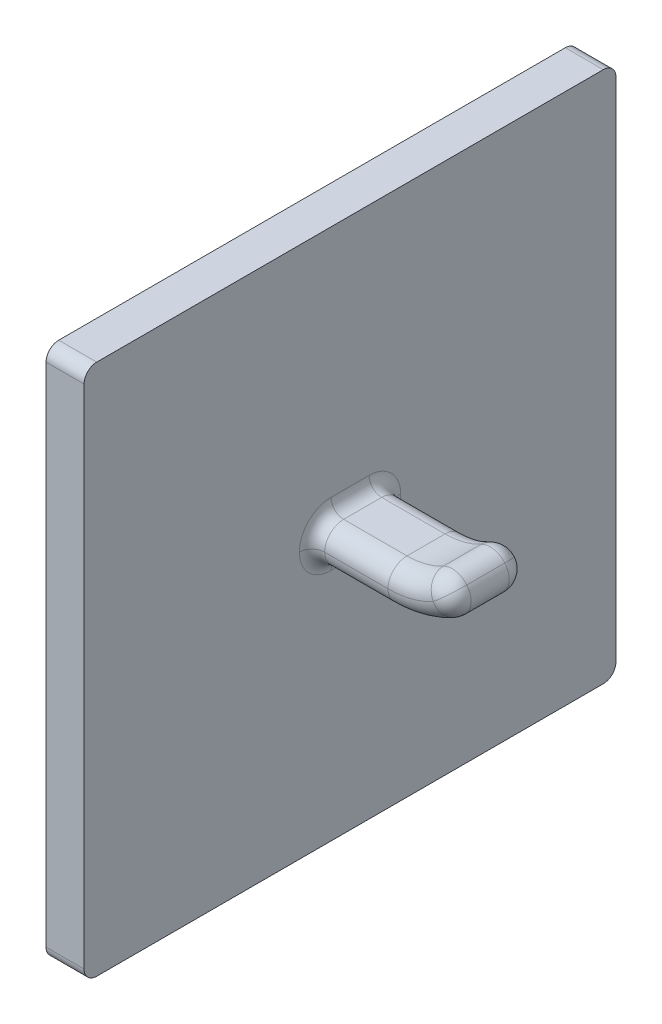
ISO-10303-21;
HEADER;
FILE_DESCRIPTION(('STEP AP214'),'2;1');
FILE_NAME('part.step','',(''),(''),'','','');
FILE_SCHEMA(('AUTOMOTIVE_DESIGN { 1 0 10303 214 1 1 1 1 }'));
ENDSEC;
DATA;
#1=APPLICATION_CONTEXT('core data for automotive mechanical design processes');
#2=APPLICATION_PROTOCOL_DEFINITION('international standard','automotive_design',2000,#1);
#3=PRODUCT_CONTEXT('',#1,'mechanical');
#4=PRODUCT('Part','Part','',(#3));
#5=PRODUCT_RELATED_PRODUCT_CATEGORY('part','',(#4));
#6=PRODUCT_DEFINITION_FORMATION('','',#4);
#7=PRODUCT_DEFINITION_CONTEXT('part definition',#1,'design');
#8=PRODUCT_DEFINITION('design','',#6,#7);
#9=PRODUCT_DEFINITION_SHAPE('','',#8);
#10=(LENGTH_UNIT() NAMED_UNIT(*) SI_UNIT(.MILLI.,.METRE.));
#11=(NAMED_UNIT(*) PLANE_ANGLE_UNIT() SI_UNIT($,.RADIAN.));
#12=(NAMED_UNIT(*) SI_UNIT($,.STERADIAN.) SOLID_ANGLE_UNIT());
#13=UNCERTAINTY_MEASURE_WITH_UNIT(LENGTH_MEASURE(1.E-05),#10,'distance_accuracy_value','');
#14=(GEOMETRIC_REPRESENTATION_CONTEXT(3) GLOBAL_UNCERTAINTY_ASSIGNED_CONTEXT((#13)) GLOBAL_UNIT_ASSIGNED_CONTEXT((#10,
#11,#12)) REPRESENTATION_CONTEXT('',''));
#15=CARTESIAN_POINT('',(0.,0.,0.));
#16=DIRECTION('',(0.,0.,1.));
#17=DIRECTION('',(1.,0.,0.));
#18=AXIS2_PLACEMENT_3D('',#15,#16,#17);
#19=CARTESIAN_POINT('',(0.,-3.,6.));
#20=DIRECTION('',(0.,1.,0.));
#21=DIRECTION('',(0.,0.,1.));
#22=AXIS2_PLACEMENT_3D('',#19,#20,#21);
#23=PLANE('',#22);
#24=DIRECTION('',(1.,0.,0.));
#25=VECTOR('',#24,1.);
#26=CARTESIAN_POINT('',(0.,-3.,4.5));
#27=LINE('',#26,#25);
#28=CARTESIAN_POINT('',(6.,-3.,4.5));
#29=VERTEX_POINT('',#28);
#30=CARTESIAN_POINT('',(1.,-3.,4.5));
#31=VERTEX_POINT('',#30);
#32=EDGE_CURVE('E305',#29,#31,#27,.F.);
#33=ORIENTED_EDGE('',*,*,#32,.T.);
#34=DIRECTION('',(0.,0.,-1.));
#35=VECTOR('',#34,1.);
#36=CARTESIAN_POINT('',(1.,-3.,1.5));
#37=LINE('',#36,#35);
#38=CARTESIAN_POINT('',(1.,-3.,1.5));
#39=VERTEX_POINT('',#38);
#40=EDGE_CURVE('E407',#31,#39,#37,.T.);
#41=ORIENTED_EDGE('',*,*,#40,.T.);
#42=DIRECTION('',(1.,0.,0.));
#43=VECTOR('',#42,1.);
#44=CARTESIAN_POINT('',(0.,-3.,1.5));
#45=LINE('',#44,#43);
#46=CARTESIAN_POINT('',(6.,-3.,1.5));
#47=VERTEX_POINT('',#46);
#48=EDGE_CURVE('E302',#39,#47,#45,.T.);
#49=ORIENTED_EDGE('',*,*,#48,.T.);
#50=DIRECTION('',(0.,0.,-1.));
#51=VECTOR('',#50,1.);
#52=CARTESIAN_POINT('',(6.,-3.,6.));
#53=LINE('',#52,#51);
#54=EDGE_CURVE('E232',#29,#47,#53,.T.);
#55=ORIENTED_EDGE('',*,*,#54,.F.);
#56=EDGE_LOOP('',(#33,#41,#49,#55));
#57=FACE_BOUND('',#56,.T.);
#58=ADVANCED_FACE('F40',(#57),#23,.F.);
#59=CARTESIAN_POINT('',(6.,6.,6.));
#60=DIRECTION('',(0.,0.,-1.));
#61=DIRECTION('',(-1.,0.,0.));
#62=AXIS2_PLACEMENT_3D('',#59,#60,#61);
#63=CYLINDRICAL_SURFACE('',#62,9.);
#64=ORIENTED_EDGE('',*,*,#54,.T.);
#65=CARTESIAN_POINT('',(6.,6.,1.5));
#66=DIRECTION('',(0.,0.,1.));
#67=DIRECTION('',(1.,0.,0.));
#68=AXIS2_PLACEMENT_3D('',#65,#66,#67);
#69=CIRCLE('',#68,9.);
#70=CARTESIAN_POINT('',(10.2893259665609,-1.91212251880532,1.5));
#71=VERTEX_POINT('',#70);
#72=EDGE_CURVE('E293',#47,#71,#69,.T.);
#73=ORIENTED_EDGE('',*,*,#72,.T.);
#74=DIRECTION('',(0.,0.,-1.));
#75=VECTOR('',#74,1.);
#76=CARTESIAN_POINT('',(10.2893259665609,-1.91212251880532,6.));
#77=LINE('',#76,#75);
#78=CARTESIAN_POINT('',(10.2893259665609,-1.91212251880532,4.5));
#79=VERTEX_POINT('',#78);
#80=EDGE_CURVE('E290',#71,#79,#77,.F.);
#81=ORIENTED_EDGE('',*,*,#80,.T.);
#82=CARTESIAN_POINT('',(6.,6.,4.5));
#83=DIRECTION('',(0.,0.,1.));
#84=DIRECTION('',(1.,0.,0.));
#85=AXIS2_PLACEMENT_3D('',#82,#83,#84);
#86=CIRCLE('',#85,9.);
#87=EDGE_CURVE('E287',#79,#29,#86,.F.);
#88=ORIENTED_EDGE('',*,*,#87,.T.);
#89=EDGE_LOOP('',(#64,#73,#81,#88));
#90=FACE_BOUND('',#89,.T.);
#91=ADVANCED_FACE('F476',(#90),#63,.T.);
#92=CARTESIAN_POINT('',(6.,6.,6.));
#93=DIRECTION('',(0.,0.,-1.));
#94=DIRECTION('',(-1.,0.,0.));
#95=AXIS2_PLACEMENT_3D('',#92,#93,#94);
#96=CYLINDRICAL_SURFACE('',#95,6.);
#97=DIRECTION('',(0.,0.,-1.));
#98=VECTOR('',#97,1.);
#99=CARTESIAN_POINT('',(8.85955064437394,0.725251654129786,6.));
#100=LINE('',#99,#98);
#101=CARTESIAN_POINT('',(8.85955064437394,0.725251654129786,4.5));
#102=VERTEX_POINT('',#101);
#103=CARTESIAN_POINT('',(8.85955064437394,0.725251654129786,1.5));
#104=VERTEX_POINT('',#103);
#105=EDGE_CURVE('E280',#102,#104,#100,.T.);
#106=ORIENTED_EDGE('',*,*,#105,.T.);
#107=CARTESIAN_POINT('',(6.,6.,1.5));
#108=DIRECTION('',(0.,0.,1.));
#109=DIRECTION('',(1.,0.,0.));
#110=AXIS2_PLACEMENT_3D('',#107,#108,#109);
#111=CIRCLE('',#110,6.);
#112=CARTESIAN_POINT('',(6.,0.,1.5));
#113=VERTEX_POINT('',#112);
#114=EDGE_CURVE('E283',#104,#113,#111,.F.);
#115=ORIENTED_EDGE('',*,*,#114,.T.);
#116=DIRECTION('',(0.,0.,-1.));
#117=VECTOR('',#116,1.);
#118=CARTESIAN_POINT('',(6.,0.,6.));
#119=LINE('',#118,#117);
#120=CARTESIAN_POINT('',(6.,0.,4.5));
#121=VERTEX_POINT('',#120);
#122=EDGE_CURVE('E228',#121,#113,#119,.T.);
#123=ORIENTED_EDGE('',*,*,#122,.F.);
#124=CARTESIAN_POINT('',(6.,6.,4.5));
#125=DIRECTION('',(0.,0.,1.));
#126=DIRECTION('',(1.,0.,0.));
#127=AXIS2_PLACEMENT_3D('',#124,#125,#126);
#128=CIRCLE('',#127,6.);
#129=EDGE_CURVE('E277',#121,#102,#128,.T.);
#130=ORIENTED_EDGE('',*,*,#129,.T.);
#131=EDGE_LOOP('',(#106,#115,#123,#130));
#132=FACE_BOUND('',#131,.T.);
#133=ADVANCED_FACE('F525',(#132),#96,.F.);
#134=CARTESIAN_POINT('',(0.,0.,6.));
#135=DIRECTION('',(0.,-1.,0.));
#136=DIRECTION('',(0.,0.,-1.));
#137=AXIS2_PLACEMENT_3D('',#134,#135,#136);
#138=PLANE('',#137);
#139=DIRECTION('',(-1.,0.,0.));
#140=VECTOR('',#139,1.);
#141=CARTESIAN_POINT('',(0.,0.,1.5));
#142=LINE('',#141,#140);
#143=CARTESIAN_POINT('',(1.,0.,1.5));
#144=VERTEX_POINT('',#143);
#145=EDGE_CURVE('E296',#113,#144,#142,.T.);
#146=ORIENTED_EDGE('',*,*,#145,.T.);
#147=DIRECTION('',(0.,0.,-1.));
#148=VECTOR('',#147,1.);
#149=CARTESIAN_POINT('',(1.,0.,4.5));
#150=LINE('',#149,#148);
#151=CARTESIAN_POINT('',(1.,0.,4.5));
#152=VERTEX_POINT('',#151);
#153=EDGE_CURVE('E11',#144,#152,#150,.F.);
#154=ORIENTED_EDGE('',*,*,#153,.T.);
#155=DIRECTION('',(-1.,0.,0.));
#156=VECTOR('',#155,1.);
#157=CARTESIAN_POINT('',(6.,0.,4.5));
#158=LINE('',#157,#156);
#159=EDGE_CURVE('E299',#152,#121,#158,.F.);
#160=ORIENTED_EDGE('',*,*,#159,.T.);
#161=ORIENTED_EDGE('',*,*,#122,.T.);
#162=EDGE_LOOP('',(#146,#154,#160,#161));
#163=FACE_BOUND('',#162,.T.);
#164=ADVANCED_FACE('F452',(#163),#138,.F.);
#165=CARTESIAN_POINT('',(0.,0.,0.));
#166=DIRECTION('',(-1.,0.,0.));
#167=DIRECTION('',(0.,0.,1.));
#168=AXIS2_PLACEMENT_3D('',#165,#166,#167);
#169=PLANE('',#168);
#170=CARTESIAN_POINT('',(0.,-1.5,4.5));
#171=DIRECTION('',(-1.,0.,0.));
#172=DIRECTION('',(0.,0.,1.));
#173=AXIS2_PLACEMENT_3D('',#170,#171,#172);
#174=CIRCLE('',#173,2.5);
#175=CARTESIAN_POINT('',(0.,-4.,4.5));
#176=VERTEX_POINT('',#175);
#177=CARTESIAN_POINT('',(0.,-1.5,7.));
#178=VERTEX_POINT('',#177);
#179=EDGE_CURVE('E393',#176,#178,#174,.T.);
#180=ORIENTED_EDGE('',*,*,#179,.T.);
#181=CARTESIAN_POINT('',(0.,-1.5,4.5));
#182=DIRECTION('',(-1.,0.,0.));
#183=DIRECTION('',(0.,0.,1.));
#184=AXIS2_PLACEMENT_3D('',#181,#182,#183);
#185=CIRCLE('',#184,2.5);
#186=CARTESIAN_POINT('',(0.,1.,4.5));
#187=VERTEX_POINT('',#186);
#188=EDGE_CURVE('E396',#178,#187,#185,.T.);
#189=ORIENTED_EDGE('',*,*,#188,.T.);
#190=DIRECTION('',(0.,0.,-1.));
#191=VECTOR('',#190,1.);
#192=CARTESIAN_POINT('',(0.,1.,1.5));
#193=LINE('',#192,#191);
#194=CARTESIAN_POINT('',(0.,1.,1.5));
#195=VERTEX_POINT('',#194);
#196=EDGE_CURVE('E309',#187,#195,#193,.T.);
#197=ORIENTED_EDGE('',*,*,#196,.T.);
#198=CARTESIAN_POINT('',(0.,-1.5,1.5));
#199=DIRECTION('',(-1.,0.,0.));
#200=DIRECTION('',(0.,0.,1.));
#201=AXIS2_PLACEMENT_3D('',#198,#199,#200);
#202=CIRCLE('',#201,2.5);
#203=CARTESIAN_POINT('',(0.,-1.5,-1.));
#204=VERTEX_POINT('',#203);
#205=EDGE_CURVE('E384',#195,#204,#202,.T.);
#206=ORIENTED_EDGE('',*,*,#205,.T.);
#207=CARTESIAN_POINT('',(0.,-1.5,1.5));
#208=DIRECTION('',(-1.,0.,0.));
#209=DIRECTION('',(0.,0.,1.));
#210=AXIS2_PLACEMENT_3D('',#207,#208,#209);
#211=CIRCLE('',#210,2.5);
#212=CARTESIAN_POINT('',(0.,-4.,1.5));
#213=VERTEX_POINT('',#212);
#214=EDGE_CURVE('E387',#204,#213,#211,.T.);
#215=ORIENTED_EDGE('',*,*,#214,.T.);
#216=DIRECTION('',(0.,0.,-1.));
#217=VECTOR('',#216,1.);
#218=CARTESIAN_POINT('',(0.,-4.,4.5));
#219=LINE('',#218,#217);
#220=EDGE_CURVE('E390',#213,#176,#219,.F.);
#221=ORIENTED_EDGE('',*,*,#220,.T.);
#222=EDGE_LOOP('',(#180,#189,#197,#206,#215,#221));
#223=FACE_BOUND('',#222,.T.);
#224=DIRECTION('',(0.,1.,0.));
#225=VECTOR('',#224,1.);
#226=CARTESIAN_POINT('',(0.,-22.5,24.));
#227=LINE('',#226,#225);
#228=CARTESIAN_POINT('',(0.,-21.5,24.));
#229=VERTEX_POINT('',#228);
#230=CARTESIAN_POINT('',(0.,18.5,24.));
#231=VERTEX_POINT('',#230);
#232=EDGE_CURVE('E205',#229,#231,#227,.T.);
#233=ORIENTED_EDGE('',*,*,#232,.F.);
#234=CARTESIAN_POINT('',(0.,-21.5,23.));
#235=DIRECTION('',(-1.,0.,0.));
#236=DIRECTION('',(0.,0.,1.));
#237=AXIS2_PLACEMENT_3D('',#234,#235,#236);
#238=CIRCLE('',#237,1.);
#239=CARTESIAN_POINT('',(0.,-22.5,23.));
#240=VERTEX_POINT('',#239);
#241=EDGE_CURVE('E187',#229,#240,#238,.F.);
#242=ORIENTED_EDGE('',*,*,#241,.T.);
#243=DIRECTION('',(0.,0.,1.));
#244=VECTOR('',#243,1.);
#245=CARTESIAN_POINT('',(0.,-22.5,24.));
#246=LINE('',#245,#244);
#247=CARTESIAN_POINT('',(0.,-22.5,-17.));
#248=VERTEX_POINT('',#247);
#249=EDGE_CURVE('E217',#248,#240,#246,.T.);
#250=ORIENTED_EDGE('',*,*,#249,.F.);
#251=CARTESIAN_POINT('',(0.,-21.5,-17.));
#252=DIRECTION('',(-1.,0.,0.));
#253=DIRECTION('',(0.,0.,1.));
#254=AXIS2_PLACEMENT_3D('',#251,#252,#253);
#255=CIRCLE('',#254,1.);
#256=CARTESIAN_POINT('',(0.,-21.5,-18.));
#257=VERTEX_POINT('',#256);
#258=EDGE_CURVE('E199',#248,#257,#255,.F.);
#259=ORIENTED_EDGE('',*,*,#258,.T.);
#260=DIRECTION('',(0.,-1.,0.));
#261=VECTOR('',#260,1.);
#262=CARTESIAN_POINT('',(0.,-22.5,-18.));
#263=LINE('',#262,#261);
#264=CARTESIAN_POINT('',(0.,18.5,-18.));
#265=VERTEX_POINT('',#264);
#266=EDGE_CURVE('E224',#265,#257,#263,.T.);
#267=ORIENTED_EDGE('',*,*,#266,.F.);
#268=CARTESIAN_POINT('',(0.,18.5,-17.));
#269=DIRECTION('',(-1.,0.,0.));
#270=DIRECTION('',(0.,0.,1.));
#271=AXIS2_PLACEMENT_3D('',#268,#269,#270);
#272=CIRCLE('',#271,1.);
#273=CARTESIAN_POINT('',(0.,19.5,-17.));
#274=VERTEX_POINT('',#273);
#275=EDGE_CURVE('E241',#265,#274,#272,.F.);
#276=ORIENTED_EDGE('',*,*,#275,.T.);
#277=DIRECTION('',(0.,0.,-1.));
#278=VECTOR('',#277,1.);
#279=CARTESIAN_POINT('',(0.,19.5,24.));
#280=LINE('',#279,#278);
#281=CARTESIAN_POINT('',(0.,19.5,23.));
#282=VERTEX_POINT('',#281);
#283=EDGE_CURVE('E216',#282,#274,#280,.T.);
#284=ORIENTED_EDGE('',*,*,#283,.F.);
#285=CARTESIAN_POINT('',(0.,18.5,23.));
#286=DIRECTION('',(-1.,0.,0.));
#287=DIRECTION('',(0.,0.,1.));
#288=AXIS2_PLACEMENT_3D('',#285,#286,#287);
#289=CIRCLE('',#288,1.);
#290=EDGE_CURVE('E210',#282,#231,#289,.F.);
#291=ORIENTED_EDGE('',*,*,#290,.T.);
#292=EDGE_LOOP('',(#233,#242,#250,#259,#267,#276,#284,#291));
#293=FACE_BOUND('',#292,.T.);
#294=ADVANCED_FACE('F213',(#223,#293),#169,.F.);
#295=CARTESIAN_POINT('',(-3.,-22.5,-18.));
#296=DIRECTION('',(0.,0.,1.));
#297=DIRECTION('',(0.,-1.,0.));
#298=AXIS2_PLACEMENT_3D('',#295,#296,#297);
#299=PLANE('',#298);
#300=ORIENTED_EDGE('',*,*,#266,.T.);
#301=DIRECTION('',(1.,0.,0.));
#302=VECTOR('',#301,1.);
#303=CARTESIAN_POINT('',(-3.,-21.5,-18.));
#304=LINE('',#303,#302);
#305=CARTESIAN_POINT('',(-3.,-21.5,-18.));
#306=VERTEX_POINT('',#305);
#307=EDGE_CURVE('E267',#257,#306,#304,.F.);
#308=ORIENTED_EDGE('',*,*,#307,.T.);
#309=DIRECTION('',(0.,-1.,0.));
#310=VECTOR('',#309,1.);
#311=CARTESIAN_POINT('',(-3.,-22.5,-18.));
#312=LINE('',#311,#310);
#313=CARTESIAN_POINT('',(-3.,18.5,-18.));
#314=VERTEX_POINT('',#313);
#315=EDGE_CURVE('E222',#314,#306,#312,.T.);
#316=ORIENTED_EDGE('',*,*,#315,.F.);
#317=DIRECTION('',(1.,0.,0.));
#318=VECTOR('',#317,1.);
#319=CARTESIAN_POINT('',(-3.,18.5,-18.));
#320=LINE('',#319,#318);
#321=EDGE_CURVE('E263',#314,#265,#320,.T.);
#322=ORIENTED_EDGE('',*,*,#321,.T.);
#323=EDGE_LOOP('',(#300,#308,#316,#322));
#324=FACE_BOUND('',#323,.T.);
#325=ADVANCED_FACE('F749',(#324),#299,.F.);
#326=CARTESIAN_POINT('',(-3.,-22.5,24.));
#327=DIRECTION('',(0.,1.,0.));
#328=DIRECTION('',(0.,0.,1.));
#329=AXIS2_PLACEMENT_3D('',#326,#327,#328);
#330=PLANE('',#329);
#331=ORIENTED_EDGE('',*,*,#249,.T.);
#332=DIRECTION('',(1.,0.,0.));
#333=VECTOR('',#332,1.);
#334=CARTESIAN_POINT('',(-3.,-22.5,23.));
#335=LINE('',#334,#333);
#336=CARTESIAN_POINT('',(-3.,-22.5,23.));
#337=VERTEX_POINT('',#336);
#338=EDGE_CURVE('E192',#240,#337,#335,.F.);
#339=ORIENTED_EDGE('',*,*,#338,.T.);
#340=DIRECTION('',(0.,0.,1.));
#341=VECTOR('',#340,1.);
#342=CARTESIAN_POINT('',(-3.,-22.5,24.));
#343=LINE('',#342,#341);
#344=CARTESIAN_POINT('',(-3.,-22.5,-17.));
#345=VERTEX_POINT('',#344);
#346=EDGE_CURVE('E815',#345,#337,#343,.T.);
#347=ORIENTED_EDGE('',*,*,#346,.F.);
#348=DIRECTION('',(1.,0.,0.));
#349=VECTOR('',#348,1.);
#350=CARTESIAN_POINT('',(-3.,-22.5,-17.));
#351=LINE('',#350,#349);
#352=EDGE_CURVE('E198',#345,#248,#351,.T.);
#353=ORIENTED_EDGE('',*,*,#352,.T.);
#354=EDGE_LOOP('',(#331,#339,#347,#353));
#355=FACE_BOUND('',#354,.T.);
#356=ADVANCED_FACE('F741',(#355),#330,.F.);
#357=CARTESIAN_POINT('',(-3.,-22.5,24.));
#358=DIRECTION('',(0.,0.,-1.));
#359=DIRECTION('',(-1.,0.,0.));
#360=AXIS2_PLACEMENT_3D('',#357,#358,#359);
#361=PLANE('',#360);
#362=DIRECTION('',(0.,1.,0.));
#363=VECTOR('',#362,1.);
#364=CARTESIAN_POINT('',(-3.,-22.5,24.));
#365=LINE('',#364,#363);
#366=CARTESIAN_POINT('',(-3.,-21.5,24.));
#367=VERTEX_POINT('',#366);
#368=CARTESIAN_POINT('',(-3.,18.5,24.));
#369=VERTEX_POINT('',#368);
#370=EDGE_CURVE('E208',#367,#369,#365,.T.);
#371=ORIENTED_EDGE('',*,*,#370,.F.);
#372=DIRECTION('',(1.,0.,0.));
#373=VECTOR('',#372,1.);
#374=CARTESIAN_POINT('',(-3.,-21.5,24.));
#375=LINE('',#374,#373);
#376=EDGE_CURVE('E191',#367,#229,#375,.T.);
#377=ORIENTED_EDGE('',*,*,#376,.T.);
#378=ORIENTED_EDGE('',*,*,#232,.T.);
#379=DIRECTION('',(1.,0.,0.));
#380=VECTOR('',#379,1.);
#381=CARTESIAN_POINT('',(-3.,18.5,24.));
#382=LINE('',#381,#380);
#383=EDGE_CURVE('E211',#231,#369,#382,.F.);
#384=ORIENTED_EDGE('',*,*,#383,.T.);
#385=EDGE_LOOP('',(#371,#377,#378,#384));
#386=FACE_BOUND('',#385,.T.);
#387=ADVANCED_FACE('F204',(#386),#361,.F.);
#388=CARTESIAN_POINT('',(-3.,19.5,24.));
#389=DIRECTION('',(0.,-1.,0.));
#390=DIRECTION('',(0.,0.,-1.));
#391=AXIS2_PLACEMENT_3D('',#388,#389,#390);
#392=PLANE('',#391);
#393=ORIENTED_EDGE('',*,*,#283,.T.);
#394=DIRECTION('',(1.,0.,0.));
#395=VECTOR('',#394,1.);
#396=CARTESIAN_POINT('',(-3.,19.5,-17.));
#397=LINE('',#396,#395);
#398=CARTESIAN_POINT('',(-3.,19.5,-17.));
#399=VERTEX_POINT('',#398);
#400=EDGE_CURVE('E274',#274,#399,#397,.F.);
#401=ORIENTED_EDGE('',*,*,#400,.T.);
#402=DIRECTION('',(0.,0.,-1.));
#403=VECTOR('',#402,1.);
#404=CARTESIAN_POINT('',(-3.,19.5,24.));
#405=LINE('',#404,#403);
#406=CARTESIAN_POINT('',(-3.,19.5,23.));
#407=VERTEX_POINT('',#406);
#408=EDGE_CURVE('E233',#407,#399,#405,.T.);
#409=ORIENTED_EDGE('',*,*,#408,.F.);
#410=DIRECTION('',(1.,0.,0.));
#411=VECTOR('',#410,1.);
#412=CARTESIAN_POINT('',(-3.,19.5,23.));
#413=LINE('',#412,#411);
#414=EDGE_CURVE('E270',#407,#282,#413,.T.);
#415=ORIENTED_EDGE('',*,*,#414,.T.);
#416=EDGE_LOOP('',(#393,#401,#409,#415));
#417=FACE_BOUND('',#416,.T.);
#418=ADVANCED_FACE('F724',(#417),#392,.F.);
#419=CARTESIAN_POINT('',(-3.,0.,0.));
#420=DIRECTION('',(-1.,0.,0.));
#421=DIRECTION('',(0.,0.,1.));
#422=AXIS2_PLACEMENT_3D('',#419,#420,#421);
#423=PLANE('',#422);
#424=ORIENTED_EDGE('',*,*,#346,.T.);
#425=CARTESIAN_POINT('',(-3.,-21.5,23.));
#426=DIRECTION('',(-1.,0.,0.));
#427=DIRECTION('',(0.,0.,1.));
#428=AXIS2_PLACEMENT_3D('',#425,#426,#427);
#429=CIRCLE('',#428,1.);
#430=EDGE_CURVE('E260',#337,#367,#429,.T.);
#431=ORIENTED_EDGE('',*,*,#430,.T.);
#432=ORIENTED_EDGE('',*,*,#370,.T.);
#433=CARTESIAN_POINT('',(-3.,18.5,23.));
#434=DIRECTION('',(-1.,0.,0.));
#435=DIRECTION('',(0.,0.,1.));
#436=AXIS2_PLACEMENT_3D('',#433,#434,#435);
#437=CIRCLE('',#436,1.);
#438=EDGE_CURVE('E251',#369,#407,#437,.T.);
#439=ORIENTED_EDGE('',*,*,#438,.T.);
#440=ORIENTED_EDGE('',*,*,#408,.T.);
#441=CARTESIAN_POINT('',(-3.,18.5,-17.));
#442=DIRECTION('',(-1.,0.,0.));
#443=DIRECTION('',(0.,0.,1.));
#444=AXIS2_PLACEMENT_3D('',#441,#442,#443);
#445=CIRCLE('',#444,1.);
#446=EDGE_CURVE('E254',#399,#314,#445,.T.);
#447=ORIENTED_EDGE('',*,*,#446,.T.);
#448=ORIENTED_EDGE('',*,*,#315,.T.);
#449=CARTESIAN_POINT('',(-3.,-21.5,-17.));
#450=DIRECTION('',(-1.,0.,0.));
#451=DIRECTION('',(0.,0.,1.));
#452=AXIS2_PLACEMENT_3D('',#449,#450,#451);
#453=CIRCLE('',#452,1.);
#454=EDGE_CURVE('E257',#306,#345,#453,.T.);
#455=ORIENTED_EDGE('',*,*,#454,.T.);
#456=EDGE_LOOP('',(#424,#431,#432,#439,#440,#447,#448,#455));
#457=FACE_BOUND('',#456,.T.);
#458=ADVANCED_FACE('F532',(#457),#423,.T.);
#459=CARTESIAN_POINT('',(-3.,-21.5,23.));
#460=DIRECTION('',(1.,0.,0.));
#461=DIRECTION('',(0.,0.,-1.));
#462=AXIS2_PLACEMENT_3D('',#459,#460,#461);
#463=CYLINDRICAL_SURFACE('',#462,1.);
#464=ORIENTED_EDGE('',*,*,#430,.F.);
#465=ORIENTED_EDGE('',*,*,#338,.F.);
#466=ORIENTED_EDGE('',*,*,#241,.F.);
#467=ORIENTED_EDGE('',*,*,#376,.F.);
#468=EDGE_LOOP('',(#464,#465,#466,#467));
#469=FACE_BOUND('',#468,.T.);
#470=ADVANCED_FACE('F190',(#469),#463,.T.);
#471=CARTESIAN_POINT('',(-3.,-21.5,-17.));
#472=DIRECTION('',(1.,0.,0.));
#473=DIRECTION('',(0.,0.,-1.));
#474=AXIS2_PLACEMENT_3D('',#471,#472,#473);
#475=CYLINDRICAL_SURFACE('',#474,1.);
#476=ORIENTED_EDGE('',*,*,#454,.F.);
#477=ORIENTED_EDGE('',*,*,#307,.F.);
#478=ORIENTED_EDGE('',*,*,#258,.F.);
#479=ORIENTED_EDGE('',*,*,#352,.F.);
#480=EDGE_LOOP('',(#476,#477,#478,#479));
#481=FACE_BOUND('',#480,.T.);
#482=ADVANCED_FACE('F531',(#481),#475,.T.);
#483=CARTESIAN_POINT('',(-3.,18.5,-17.));
#484=DIRECTION('',(1.,0.,0.));
#485=DIRECTION('',(0.,0.,-1.));
#486=AXIS2_PLACEMENT_3D('',#483,#484,#485);
#487=CYLINDRICAL_SURFACE('',#486,1.);
#488=ORIENTED_EDGE('',*,*,#446,.F.);
#489=ORIENTED_EDGE('',*,*,#400,.F.);
#490=ORIENTED_EDGE('',*,*,#275,.F.);
#491=ORIENTED_EDGE('',*,*,#321,.F.);
#492=EDGE_LOOP('',(#488,#489,#490,#491));
#493=FACE_BOUND('',#492,.T.);
#494=ADVANCED_FACE('F535',(#493),#487,.T.);
#495=CARTESIAN_POINT('',(-3.,18.5,23.));
#496=DIRECTION('',(1.,0.,0.));
#497=DIRECTION('',(0.,0.,-1.));
#498=AXIS2_PLACEMENT_3D('',#495,#496,#497);
#499=CYLINDRICAL_SURFACE('',#498,1.);
#500=ORIENTED_EDGE('',*,*,#438,.F.);
#501=ORIENTED_EDGE('',*,*,#383,.F.);
#502=ORIENTED_EDGE('',*,*,#290,.F.);
#503=ORIENTED_EDGE('',*,*,#414,.F.);
#504=EDGE_LOOP('',(#500,#501,#502,#503));
#505=FACE_BOUND('',#504,.T.);
#506=ADVANCED_FACE('F539',(#505),#499,.T.);
#507=CARTESIAN_POINT('',(6.,-1.5,4.5));
#508=DIRECTION('',(-1.,0.,0.));
#509=DIRECTION('',(0.,0.,1.));
#510=AXIS2_PLACEMENT_3D('',#507,#508,#509);
#511=CYLINDRICAL_SURFACE('',#510,1.5);
#512=DIRECTION('',(1.,0.,0.));
#513=VECTOR('',#512,1.);
#514=CARTESIAN_POINT('',(6.,-1.5,6.));
#515=LINE('',#514,#513);
#516=CARTESIAN_POINT('',(1.,-1.5,6.));
#517=VERTEX_POINT('',#516);
#518=CARTESIAN_POINT('',(6.,-1.5,6.));
#519=VERTEX_POINT('',#518);
#520=EDGE_CURVE('E375',#517,#519,#515,.T.);
#521=ORIENTED_EDGE('',*,*,#520,.F.);
#522=CARTESIAN_POINT('',(1.,-1.5,4.5));
#523=DIRECTION('',(-1.,0.,0.));
#524=DIRECTION('',(0.,0.,1.));
#525=AXIS2_PLACEMENT_3D('',#522,#523,#524);
#526=CIRCLE('',#525,1.5);
#527=EDGE_CURVE('E404',#517,#31,#526,.F.);
#528=ORIENTED_EDGE('',*,*,#527,.T.);
#529=ORIENTED_EDGE('',*,*,#32,.F.);
#530=CARTESIAN_POINT('',(6.,-1.5,4.5));
#531=DIRECTION('',(1.,0.,0.));
#532=DIRECTION('',(0.,0.,-1.));
#533=AXIS2_PLACEMENT_3D('',#530,#531,#532);
#534=CIRCLE('',#533,1.5);
#535=EDGE_CURVE('E378',#519,#29,#534,.T.);
#536=ORIENTED_EDGE('',*,*,#535,.F.);
#537=EDGE_LOOP('',(#521,#528,#529,#536));
#538=FACE_BOUND('',#537,.T.);
#539=ADVANCED_FACE('F470',(#538),#511,.T.);
#540=CARTESIAN_POINT('',(6.,6.,4.5));
#541=DIRECTION('',(0.,0.,1.));
#542=DIRECTION('',(1.,0.,0.));
#543=AXIS2_PLACEMENT_3D('',#540,#541,#542);
#544=TOROIDAL_SURFACE('',#543,7.5,1.5);
#545=ORIENTED_EDGE('',*,*,#535,.T.);
#546=ORIENTED_EDGE('',*,*,#87,.F.);
#547=CARTESIAN_POINT('',(9.57443830546743,-0.593435432337769,4.5));
#548=DIRECTION('',(0.879124724311702,0.476591774062326,0.));
#549=DIRECTION('',(-0.476591774062326,0.879124724311702,0.));
#550=AXIS2_PLACEMENT_3D('',#547,#548,#549);
#551=CIRCLE('',#550,1.5);
#552=CARTESIAN_POINT('',(9.57443830546743,-0.593435432337767,6.));
#553=VERTEX_POINT('',#552);
#554=EDGE_CURVE('E371',#553,#79,#551,.T.);
#555=ORIENTED_EDGE('',*,*,#554,.F.);
#556=CARTESIAN_POINT('',(6.,6.,6.));
#557=DIRECTION('',(0.,0.,1.));
#558=DIRECTION('',(1.,0.,0.));
#559=AXIS2_PLACEMENT_3D('',#556,#557,#558);
#560=CIRCLE('',#559,7.5);
#561=EDGE_CURVE('E363',#519,#553,#560,.T.);
#562=ORIENTED_EDGE('',*,*,#561,.F.);
#563=EDGE_LOOP('',(#545,#546,#555,#562));
#564=FACE_BOUND('',#563,.T.);
#565=ADVANCED_FACE('F500',(#564),#544,.T.);
#566=CARTESIAN_POINT('',(6.,-1.5,4.5));
#567=DIRECTION('',(1.,0.,0.));
#568=DIRECTION('',(0.,0.,-1.));
#569=AXIS2_PLACEMENT_3D('',#566,#567,#568);
#570=CYLINDRICAL_SURFACE('',#569,1.5);
#571=ORIENTED_EDGE('',*,*,#159,.F.);
#572=CARTESIAN_POINT('',(1.,-1.5,4.5));
#573=DIRECTION('',(-1.,0.,0.));
#574=DIRECTION('',(0.,0.,1.));
#575=AXIS2_PLACEMENT_3D('',#572,#573,#574);
#576=CIRCLE('',#575,1.5);
#577=EDGE_CURVE('E400',#152,#517,#576,.F.);
#578=ORIENTED_EDGE('',*,*,#577,.T.);
#579=ORIENTED_EDGE('',*,*,#520,.T.);
#580=CARTESIAN_POINT('',(6.,-1.5,4.5));
#581=DIRECTION('',(1.,0.,0.));
#582=DIRECTION('',(0.,0.,-1.));
#583=AXIS2_PLACEMENT_3D('',#580,#581,#582);
#584=CIRCLE('',#583,1.5);
#585=EDGE_CURVE('E359',#121,#519,#584,.T.);
#586=ORIENTED_EDGE('',*,*,#585,.F.);
#587=EDGE_LOOP('',(#571,#578,#579,#586));
#588=FACE_BOUND('',#587,.T.);
#589=ADVANCED_FACE('F457',(#588),#570,.T.);
#590=CARTESIAN_POINT('',(9.57443830546743,-0.593435432337768,4.5));
#591=DIRECTION('',(0.,0.,1.));
#592=DIRECTION('',(1.,0.,0.));
#593=AXIS2_PLACEMENT_3D('',#590,#591,#592);
#594=SPHERICAL_SURFACE('',#593,1.5);
#595=CARTESIAN_POINT('',(9.57443830546743,-0.593435432337769,4.5));
#596=DIRECTION('',(0.642787609686539,-0.766044443118978,0.));
#597=DIRECTION('',(0.766044443118978,0.642787609686539,0.));
#598=AXIS2_PLACEMENT_3D('',#595,#596,#597);
#599=CIRCLE('',#598,1.5);
#600=CARTESIAN_POINT('',(10.7235049701459,0.370745982192043,4.5));
#601=VERTEX_POINT('',#600);
#602=EDGE_CURVE('E367',#553,#601,#599,.F.);
#603=ORIENTED_EDGE('',*,*,#602,.F.);
#604=ORIENTED_EDGE('',*,*,#554,.T.);
#605=CARTESIAN_POINT('',(9.57443830546743,-0.593435432337767,4.5));
#606=DIRECTION('',(0.,0.,1.));
#607=DIRECTION('',(1.,0.,0.));
#608=AXIS2_PLACEMENT_3D('',#605,#606,#607);
#609=CIRCLE('',#608,1.5);
#610=EDGE_CURVE('E355',#601,#79,#609,.F.);
#611=ORIENTED_EDGE('',*,*,#610,.F.);
#612=EDGE_LOOP('',(#603,#604,#611));
#613=FACE_BOUND('',#612,.T.);
#614=ADVANCED_FACE('F504',(#613),#594,.T.);
#615=CARTESIAN_POINT('',(6.,6.,4.5));
#616=DIRECTION('',(0.,0.,1.));
#617=DIRECTION('',(1.,0.,0.));
#618=AXIS2_PLACEMENT_3D('',#615,#616,#617);
#619=TOROIDAL_SURFACE('',#618,7.5,1.5);
#620=ORIENTED_EDGE('',*,*,#585,.T.);
#621=ORIENTED_EDGE('',*,*,#561,.T.);
#622=CARTESIAN_POINT('',(9.57443830546743,-0.593435432337767,4.5));
#623=DIRECTION('',(0.879124724311702,0.476591774062324,0.));
#624=DIRECTION('',(-0.476591774062324,0.879124724311702,0.));
#625=AXIS2_PLACEMENT_3D('',#622,#623,#624);
#626=CIRCLE('',#625,1.5);
#627=EDGE_CURVE('E351',#102,#553,#626,.T.);
#628=ORIENTED_EDGE('',*,*,#627,.F.);
#629=ORIENTED_EDGE('',*,*,#129,.F.);
#630=EDGE_LOOP('',(#620,#621,#628,#629));
#631=FACE_BOUND('',#630,.T.);
#632=ADVANCED_FACE('F508',(#631),#619,.T.);
#633=CARTESIAN_POINT('',(9.57443830546743,-0.593435432337767,6.));
#634=DIRECTION('',(0.,0.,-1.));
#635=DIRECTION('',(-1.,0.,0.));
#636=AXIS2_PLACEMENT_3D('',#633,#634,#635);
#637=CYLINDRICAL_SURFACE('',#636,1.5);
#638=ORIENTED_EDGE('',*,*,#610,.T.);
#639=ORIENTED_EDGE('',*,*,#80,.F.);
#640=CARTESIAN_POINT('',(9.57443830546743,-0.593435432337769,1.5));
#641=DIRECTION('',(0.,0.,-1.));
#642=DIRECTION('',(-1.,0.,0.));
#643=AXIS2_PLACEMENT_3D('',#640,#641,#642);
#644=CIRCLE('',#643,1.5);
#645=CARTESIAN_POINT('',(10.7235049701459,0.370745982192043,1.5));
#646=VERTEX_POINT('',#645);
#647=EDGE_CURVE('E347',#646,#71,#644,.T.);
#648=ORIENTED_EDGE('',*,*,#647,.F.);
#649=DIRECTION('',(0.,0.,-1.));
#650=VECTOR('',#649,1.);
#651=CARTESIAN_POINT('',(10.7235049701459,0.370745982192041,6.));
#652=LINE('',#651,#650);
#653=EDGE_CURVE('E339',#601,#646,#652,.T.);
#654=ORIENTED_EDGE('',*,*,#653,.F.);
#655=EDGE_LOOP('',(#638,#639,#648,#654));
#656=FACE_BOUND('',#655,.T.);
#657=ADVANCED_FACE('F498',(#656),#637,.T.);
#658=CARTESIAN_POINT('',(9.57443830546743,-0.593435432337767,4.5));
#659=DIRECTION('',(0.,0.,1.));
#660=DIRECTION('',(0.,-1.,0.));
#661=AXIS2_PLACEMENT_3D('',#658,#659,#660);
#662=SPHERICAL_SURFACE('',#661,1.5);
#663=ORIENTED_EDGE('',*,*,#627,.T.);
#664=ORIENTED_EDGE('',*,*,#602,.T.);
#665=CARTESIAN_POINT('',(9.57443830546743,-0.593435432337767,4.5));
#666=DIRECTION('',(0.,0.,1.));
#667=DIRECTION('',(1.,0.,0.));
#668=AXIS2_PLACEMENT_3D('',#665,#666,#667);
#669=CIRCLE('',#668,1.5);
#670=EDGE_CURVE('E335',#102,#601,#669,.F.);
#671=ORIENTED_EDGE('',*,*,#670,.F.);
#672=EDGE_LOOP('',(#663,#664,#671));
#673=FACE_BOUND('',#672,.T.);
#674=ADVANCED_FACE('F509',(#673),#662,.T.);
#675=CARTESIAN_POINT('',(9.57443830546743,-0.593435432337768,1.5));
#676=DIRECTION('',(0.,0.,-1.));
#677=DIRECTION('',(0.,1.,0.));
#678=AXIS2_PLACEMENT_3D('',#675,#676,#677);
#679=SPHERICAL_SURFACE('',#678,1.5);
#680=CARTESIAN_POINT('',(9.57443830546743,-0.593435432337768,1.5));
#681=DIRECTION('',(0.64278760968654,-0.766044443118978,0.));
#682=DIRECTION('',(0.766044443118978,0.64278760968654,0.));
#683=AXIS2_PLACEMENT_3D('',#680,#681,#682);
#684=CIRCLE('',#683,1.5);
#685=CARTESIAN_POINT('',(9.57443830546743,-0.593435432337767,0.));
#686=VERTEX_POINT('',#685);
#687=EDGE_CURVE('E343',#646,#686,#684,.F.);
#688=ORIENTED_EDGE('',*,*,#687,.F.);
#689=ORIENTED_EDGE('',*,*,#647,.T.);
#690=CARTESIAN_POINT('',(9.57443830546743,-0.593435432337767,1.5));
#691=DIRECTION('',(0.879124724311702,0.476591774062324,0.));
#692=DIRECTION('',(-0.476591774062324,0.879124724311702,0.));
#693=AXIS2_PLACEMENT_3D('',#690,#691,#692);
#694=CIRCLE('',#693,1.5);
#695=EDGE_CURVE('E328',#686,#71,#694,.F.);
#696=ORIENTED_EDGE('',*,*,#695,.F.);
#697=EDGE_LOOP('',(#688,#689,#696));
#698=FACE_BOUND('',#697,.T.);
#699=ADVANCED_FACE('F486',(#698),#679,.T.);
#700=CARTESIAN_POINT('',(9.57443830546743,-0.593435432337766,6.));
#701=DIRECTION('',(0.,0.,-1.));
#702=DIRECTION('',(-1.,0.,0.));
#703=AXIS2_PLACEMENT_3D('',#700,#701,#702);
#704=CYLINDRICAL_SURFACE('',#703,1.5);
#705=ORIENTED_EDGE('',*,*,#670,.T.);
#706=ORIENTED_EDGE('',*,*,#653,.T.);
#707=CARTESIAN_POINT('',(9.57443830546743,-0.593435432337767,1.5));
#708=DIRECTION('',(0.,0.,-1.));
#709=DIRECTION('',(-1.,0.,0.));
#710=AXIS2_PLACEMENT_3D('',#707,#708,#709);
#711=CIRCLE('',#710,1.5);
#712=EDGE_CURVE('E324',#104,#646,#711,.T.);
#713=ORIENTED_EDGE('',*,*,#712,.F.);
#714=ORIENTED_EDGE('',*,*,#105,.F.);
#715=EDGE_LOOP('',(#705,#706,#713,#714));
#716=FACE_BOUND('',#715,.T.);
#717=ADVANCED_FACE('F494',(#716),#704,.T.);
#718=CARTESIAN_POINT('',(0.,-1.5,1.5));
#719=DIRECTION('',(1.,0.,0.));
#720=DIRECTION('',(0.,0.,-1.));
#721=AXIS2_PLACEMENT_3D('',#718,#719,#720);
#722=CYLINDRICAL_SURFACE('',#721,1.5);
#723=ORIENTED_EDGE('',*,*,#48,.F.);
#724=CARTESIAN_POINT('',(1.,-1.5,1.5));
#725=DIRECTION('',(-1.,0.,0.));
#726=DIRECTION('',(0.,0.,1.));
#727=AXIS2_PLACEMENT_3D('',#724,#725,#726);
#728=CIRCLE('',#727,1.5);
#729=CARTESIAN_POINT('',(1.,-1.5,0.));
#730=VERTEX_POINT('',#729);
#731=EDGE_CURVE('E65',#39,#730,#728,.F.);
#732=ORIENTED_EDGE('',*,*,#731,.T.);
#733=DIRECTION('',(1.,0.,0.));
#734=VECTOR('',#733,1.);
#735=CARTESIAN_POINT('',(6.,-1.5,0.));
#736=LINE('',#735,#734);
#737=CARTESIAN_POINT('',(6.,-1.5,0.));
#738=VERTEX_POINT('',#737);
#739=EDGE_CURVE('E321',#738,#730,#736,.F.);
#740=ORIENTED_EDGE('',*,*,#739,.F.);
#741=CARTESIAN_POINT('',(6.,-1.5,1.5));
#742=DIRECTION('',(1.,0.,0.));
#743=DIRECTION('',(0.,0.,-1.));
#744=AXIS2_PLACEMENT_3D('',#741,#742,#743);
#745=CIRCLE('',#744,1.5);
#746=EDGE_CURVE('E332',#47,#738,#745,.T.);
#747=ORIENTED_EDGE('',*,*,#746,.F.);
#748=EDGE_LOOP('',(#723,#732,#740,#747));
#749=FACE_BOUND('',#748,.T.);
#750=ADVANCED_FACE('F480',(#749),#722,.T.);
#751=CARTESIAN_POINT('',(6.,6.,1.5));
#752=DIRECTION('',(0.,0.,1.));
#753=DIRECTION('',(1.,0.,0.));
#754=AXIS2_PLACEMENT_3D('',#751,#752,#753);
#755=TOROIDAL_SURFACE('',#754,7.5,1.5);
#756=ORIENTED_EDGE('',*,*,#72,.F.);
#757=ORIENTED_EDGE('',*,*,#746,.T.);
#758=CARTESIAN_POINT('',(6.,6.,0.));
#759=DIRECTION('',(0.,0.,1.));
#760=DIRECTION('',(1.,0.,0.));
#761=AXIS2_PLACEMENT_3D('',#758,#759,#760);
#762=CIRCLE('',#761,7.5);
#763=EDGE_CURVE('E317',#686,#738,#762,.F.);
#764=ORIENTED_EDGE('',*,*,#763,.F.);
#765=ORIENTED_EDGE('',*,*,#695,.T.);
#766=EDGE_LOOP('',(#756,#757,#764,#765));
#767=FACE_BOUND('',#766,.T.);
#768=ADVANCED_FACE('F483',(#767),#755,.T.);
#769=CARTESIAN_POINT('',(9.57443830546743,-0.593435432337767,1.5));
#770=DIRECTION('',(0.,0.,-1.));
#771=DIRECTION('',(0.,1.,0.));
#772=AXIS2_PLACEMENT_3D('',#769,#770,#771);
#773=SPHERICAL_SURFACE('',#772,1.5);
#774=ORIENTED_EDGE('',*,*,#712,.T.);
#775=ORIENTED_EDGE('',*,*,#687,.T.);
#776=CARTESIAN_POINT('',(9.57443830546743,-0.593435432337767,1.5));
#777=DIRECTION('',(0.879124724311702,0.476591774062324,0.));
#778=DIRECTION('',(-0.476591774062324,0.879124724311702,0.));
#779=AXIS2_PLACEMENT_3D('',#776,#777,#778);
#780=CIRCLE('',#779,1.5);
#781=EDGE_CURVE('E313',#104,#686,#780,.F.);
#782=ORIENTED_EDGE('',*,*,#781,.F.);
#783=EDGE_LOOP('',(#774,#775,#782));
#784=FACE_BOUND('',#783,.T.);
#785=ADVANCED_FACE('F489',(#784),#773,.T.);
#786=CARTESIAN_POINT('',(0.,-1.5,1.5));
#787=DIRECTION('',(-1.,0.,0.));
#788=DIRECTION('',(0.,0.,1.));
#789=AXIS2_PLACEMENT_3D('',#786,#787,#788);
#790=CYLINDRICAL_SURFACE('',#789,1.5);
#791=ORIENTED_EDGE('',*,*,#739,.T.);
#792=CARTESIAN_POINT('',(1.,-1.5,1.5));
#793=DIRECTION('',(-1.,0.,0.));
#794=DIRECTION('',(0.,0.,1.));
#795=AXIS2_PLACEMENT_3D('',#792,#793,#794);
#796=CIRCLE('',#795,1.5);
#797=EDGE_CURVE('E50',#730,#144,#796,.F.);
#798=ORIENTED_EDGE('',*,*,#797,.T.);
#799=ORIENTED_EDGE('',*,*,#145,.F.);
#800=CARTESIAN_POINT('',(6.,-1.5,1.5));
#801=DIRECTION('',(1.,0.,0.));
#802=DIRECTION('',(0.,0.,-1.));
#803=AXIS2_PLACEMENT_3D('',#800,#801,#802);
#804=CIRCLE('',#803,1.5);
#805=EDGE_CURVE('E310',#738,#113,#804,.T.);
#806=ORIENTED_EDGE('',*,*,#805,.F.);
#807=EDGE_LOOP('',(#791,#798,#799,#806));
#808=FACE_BOUND('',#807,.T.);
#809=ADVANCED_FACE('F547',(#808),#790,.T.);
#810=CARTESIAN_POINT('',(6.,6.,1.5));
#811=DIRECTION('',(0.,0.,1.));
#812=DIRECTION('',(1.,0.,0.));
#813=AXIS2_PLACEMENT_3D('',#810,#811,#812);
#814=TOROIDAL_SURFACE('',#813,7.5,1.5);
#815=ORIENTED_EDGE('',*,*,#781,.T.);
#816=ORIENTED_EDGE('',*,*,#763,.T.);
#817=ORIENTED_EDGE('',*,*,#805,.T.);
#818=ORIENTED_EDGE('',*,*,#114,.F.);
#819=EDGE_LOOP('',(#815,#816,#817,#818));
#820=FACE_BOUND('',#819,.T.);
#821=ADVANCED_FACE('F544',(#820),#814,.T.);
#822=CARTESIAN_POINT('',(1.,-1.5,1.5));
#823=DIRECTION('',(-1.,0.,0.));
#824=DIRECTION('',(0.,0.,1.));
#825=AXIS2_PLACEMENT_3D('',#822,#823,#824);
#826=TOROIDAL_SURFACE('',#825,2.5,1.);
#827=CARTESIAN_POINT('',(1.,-1.5,-1.));
#828=DIRECTION('',(0.,-1.,0.));
#829=DIRECTION('',(0.,0.,-1.));
#830=AXIS2_PLACEMENT_3D('',#827,#828,#829);
#831=CIRCLE('',#830,1.);
#832=EDGE_CURVE('E427',#730,#204,#831,.T.);
#833=ORIENTED_EDGE('',*,*,#832,.F.);
#834=ORIENTED_EDGE('',*,*,#731,.F.);
#835=CARTESIAN_POINT('',(1.,-4.,1.5));
#836=DIRECTION('',(0.,0.,-1.));
#837=DIRECTION('',(-1.,0.,0.));
#838=AXIS2_PLACEMENT_3D('',#835,#836,#837);
#839=CIRCLE('',#838,1.);
#840=EDGE_CURVE('E44',#213,#39,#839,.T.);
#841=ORIENTED_EDGE('',*,*,#840,.F.);
#842=ORIENTED_EDGE('',*,*,#214,.F.);
#843=EDGE_LOOP('',(#833,#834,#841,#842));
#844=FACE_BOUND('',#843,.T.);
#845=ADVANCED_FACE('F42',(#844),#826,.F.);
#846=CARTESIAN_POINT('',(1.,-4.,6.));
#847=DIRECTION('',(0.,0.,1.));
#848=DIRECTION('',(1.,0.,0.));
#849=AXIS2_PLACEMENT_3D('',#846,#847,#848);
#850=CYLINDRICAL_SURFACE('',#849,1.);
#851=ORIENTED_EDGE('',*,*,#840,.T.);
#852=ORIENTED_EDGE('',*,*,#40,.F.);
#853=CARTESIAN_POINT('',(1.,-4.,4.5));
#854=DIRECTION('',(0.,0.,-1.));
#855=DIRECTION('',(-1.,0.,0.));
#856=AXIS2_PLACEMENT_3D('',#853,#854,#855);
#857=CIRCLE('',#856,1.);
#858=EDGE_CURVE('E424',#176,#31,#857,.T.);
#859=ORIENTED_EDGE('',*,*,#858,.F.);
#860=ORIENTED_EDGE('',*,*,#220,.F.);
#861=EDGE_LOOP('',(#851,#852,#859,#860));
#862=FACE_BOUND('',#861,.T.);
#863=ADVANCED_FACE('F439',(#862),#850,.F.);
#864=CARTESIAN_POINT('',(1.,-1.5,1.5));
#865=DIRECTION('',(-1.,0.,0.));
#866=DIRECTION('',(0.,0.,1.));
#867=AXIS2_PLACEMENT_3D('',#864,#865,#866);
#868=TOROIDAL_SURFACE('',#867,2.5,1.);
#869=ORIENTED_EDGE('',*,*,#832,.T.);
#870=ORIENTED_EDGE('',*,*,#205,.F.);
#871=CARTESIAN_POINT('',(1.,1.,1.5));
#872=DIRECTION('',(0.,0.,-1.));
#873=DIRECTION('',(-1.,0.,0.));
#874=AXIS2_PLACEMENT_3D('',#871,#872,#873);
#875=CIRCLE('',#874,1.);
#876=EDGE_CURVE('E420',#144,#195,#875,.T.);
#877=ORIENTED_EDGE('',*,*,#876,.F.);
#878=ORIENTED_EDGE('',*,*,#797,.F.);
#879=EDGE_LOOP('',(#869,#870,#877,#878));
#880=FACE_BOUND('',#879,.T.);
#881=ADVANCED_FACE('F444',(#880),#868,.F.);
#882=CARTESIAN_POINT('',(1.,-1.5,4.5));
#883=DIRECTION('',(-1.,0.,0.));
#884=DIRECTION('',(0.,0.,1.));
#885=AXIS2_PLACEMENT_3D('',#882,#883,#884);
#886=TOROIDAL_SURFACE('',#885,2.5,1.);
#887=ORIENTED_EDGE('',*,*,#858,.T.);
#888=ORIENTED_EDGE('',*,*,#527,.F.);
#889=CARTESIAN_POINT('',(1.,-1.5,7.));
#890=DIRECTION('',(0.,-1.,0.));
#891=DIRECTION('',(0.,0.,-1.));
#892=AXIS2_PLACEMENT_3D('',#889,#890,#891);
#893=CIRCLE('',#892,1.);
#894=EDGE_CURVE('E417',#178,#517,#893,.T.);
#895=ORIENTED_EDGE('',*,*,#894,.F.);
#896=ORIENTED_EDGE('',*,*,#179,.F.);
#897=EDGE_LOOP('',(#887,#888,#895,#896));
#898=FACE_BOUND('',#897,.T.);
#899=ADVANCED_FACE('F467',(#898),#886,.F.);
#900=CARTESIAN_POINT('',(1.,1.,0.));
#901=DIRECTION('',(0.,0.,1.));
#902=DIRECTION('',(1.,0.,0.));
#903=AXIS2_PLACEMENT_3D('',#900,#901,#902);
#904=CYLINDRICAL_SURFACE('',#903,1.);
#905=ORIENTED_EDGE('',*,*,#876,.T.);
#906=ORIENTED_EDGE('',*,*,#196,.F.);
#907=CARTESIAN_POINT('',(1.,1.,4.5));
#908=DIRECTION('',(0.,0.,-1.));
#909=DIRECTION('',(-1.,0.,0.));
#910=AXIS2_PLACEMENT_3D('',#907,#908,#909);
#911=CIRCLE('',#910,1.);
#912=EDGE_CURVE('E414',#152,#187,#911,.T.);
#913=ORIENTED_EDGE('',*,*,#912,.F.);
#914=ORIENTED_EDGE('',*,*,#153,.F.);
#915=EDGE_LOOP('',(#905,#906,#913,#914));
#916=FACE_BOUND('',#915,.T.);
#917=ADVANCED_FACE('F449',(#916),#904,.F.);
#918=CARTESIAN_POINT('',(1.,-1.5,4.5));
#919=DIRECTION('',(-1.,0.,0.));
#920=DIRECTION('',(0.,0.,1.));
#921=AXIS2_PLACEMENT_3D('',#918,#919,#920);
#922=TOROIDAL_SURFACE('',#921,2.5,1.);
#923=ORIENTED_EDGE('',*,*,#894,.T.);
#924=ORIENTED_EDGE('',*,*,#577,.F.);
#925=ORIENTED_EDGE('',*,*,#912,.T.);
#926=ORIENTED_EDGE('',*,*,#188,.F.);
#927=EDGE_LOOP('',(#923,#924,#925,#926));
#928=FACE_BOUND('',#927,.T.);
#929=ADVANCED_FACE('F461',(#928),#922,.F.);
#930=CLOSED_SHELL('',(#58,#91,#133,#164,#294,#325,#356,#387,#418,#458,#470,#482,#494,#506,#539,
#565,#589,#614,#632,#657,#674,#699,#717,#750,#768,#785,#809,#821,#845,#863,#881,#899,#917,#929));
#931=MANIFOLD_SOLID_BREP('B2',#930);
#932=ADVANCED_BREP_SHAPE_REPRESENTATION('',(#18,#931),#14);
#933=SHAPE_DEFINITION_REPRESENTATION(#9,#932);
ENDSEC;
END-ISO-10303-21;
